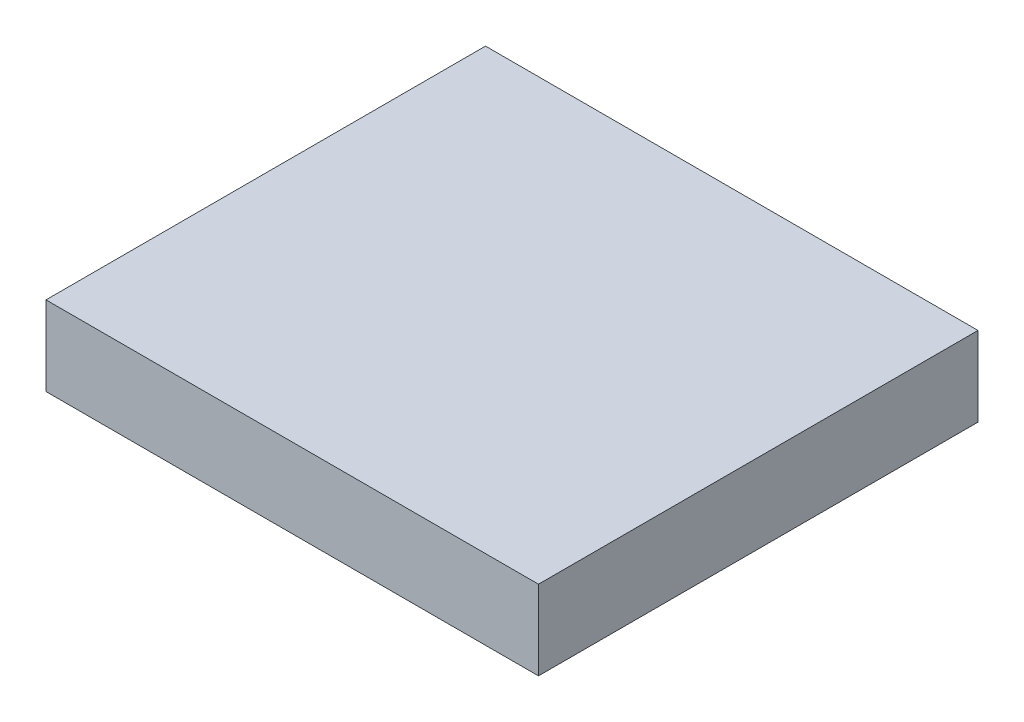
ISO-10303-21;
HEADER;
FILE_DESCRIPTION(('STEP AP214'),'2;1');
FILE_NAME('part.step','',(''),(''),'','','');
FILE_SCHEMA(('AUTOMOTIVE_DESIGN { 1 0 10303 214 1 1 1 1 }'));
ENDSEC;
DATA;
#1=APPLICATION_CONTEXT('core data for automotive mechanical design processes');
#2=APPLICATION_PROTOCOL_DEFINITION('international standard','automotive_design',2000,#1);
#3=PRODUCT_CONTEXT('',#1,'mechanical');
#4=PRODUCT('Part','Part','',(#3));
#5=PRODUCT_RELATED_PRODUCT_CATEGORY('part','',(#4));
#6=PRODUCT_DEFINITION_FORMATION('','',#4);
#7=PRODUCT_DEFINITION_CONTEXT('part definition',#1,'design');
#8=PRODUCT_DEFINITION('design','',#6,#7);
#9=PRODUCT_DEFINITION_SHAPE('','',#8);
#10=(LENGTH_UNIT() NAMED_UNIT(*) SI_UNIT(.MILLI.,.METRE.));
#11=(NAMED_UNIT(*) PLANE_ANGLE_UNIT() SI_UNIT($,.RADIAN.));
#12=(NAMED_UNIT(*) SI_UNIT($,.STERADIAN.) SOLID_ANGLE_UNIT());
#13=UNCERTAINTY_MEASURE_WITH_UNIT(LENGTH_MEASURE(1.E-05),#10,'distance_accuracy_value','');
#14=(GEOMETRIC_REPRESENTATION_CONTEXT(3) GLOBAL_UNCERTAINTY_ASSIGNED_CONTEXT((#13)) GLOBAL_UNIT_ASSIGNED_CONTEXT((#10,
#11,#12)) REPRESENTATION_CONTEXT('',''));
#15=CARTESIAN_POINT('',(0.,0.,0.));
#16=DIRECTION('',(0.,0.,1.));
#17=DIRECTION('',(1.,0.,0.));
#18=AXIS2_PLACEMENT_3D('',#15,#16,#17);
#19=CARTESIAN_POINT('',(46.5,15.,-41.5));
#20=DIRECTION('',(-1.,0.,0.));
#21=DIRECTION('',(0.,0.,1.));
#22=AXIS2_PLACEMENT_3D('',#19,#20,#21);
#23=PLANE('',#22);
#24=DIRECTION('',(0.,0.,-1.));
#25=VECTOR('',#24,1.);
#26=CARTESIAN_POINT('',(46.5,0.,-41.5));
#27=LINE('',#26,#25);
#28=CARTESIAN_POINT('',(46.5,0.,41.5));
#29=VERTEX_POINT('',#28);
#30=CARTESIAN_POINT('',(46.5,0.,-41.5));
#31=VERTEX_POINT('',#30);
#32=EDGE_CURVE('E95',#29,#31,#27,.T.);
#33=ORIENTED_EDGE('',*,*,#32,.T.);
#34=DIRECTION('',(0.,-1.,0.));
#35=VECTOR('',#34,1.);
#36=CARTESIAN_POINT('',(46.5,15.,-41.5));
#37=LINE('',#36,#35);
#38=CARTESIAN_POINT('',(46.5,15.,-41.5));
#39=VERTEX_POINT('',#38);
#40=EDGE_CURVE('E11',#39,#31,#37,.T.);
#41=ORIENTED_EDGE('',*,*,#40,.F.);
#42=DIRECTION('',(0.,0.,-1.));
#43=VECTOR('',#42,1.);
#44=CARTESIAN_POINT('',(46.5,15.,-41.5));
#45=LINE('',#44,#43);
#46=CARTESIAN_POINT('',(46.5,15.,41.5));
#47=VERTEX_POINT('',#46);
#48=EDGE_CURVE('E83',#47,#39,#45,.T.);
#49=ORIENTED_EDGE('',*,*,#48,.F.);
#50=DIRECTION('',(0.,-1.,0.));
#51=VECTOR('',#50,1.);
#52=CARTESIAN_POINT('',(46.5,15.,41.5));
#53=LINE('',#52,#51);
#54=EDGE_CURVE('E91',#47,#29,#53,.T.);
#55=ORIENTED_EDGE('',*,*,#54,.T.);
#56=EDGE_LOOP('',(#33,#41,#49,#55));
#57=FACE_BOUND('',#56,.T.);
#58=ADVANCED_FACE('F32',(#57),#23,.F.);
#59=CARTESIAN_POINT('',(-46.5,15.,-41.5));
#60=DIRECTION('',(0.,0.,1.));
#61=DIRECTION('',(1.,0.,0.));
#62=AXIS2_PLACEMENT_3D('',#59,#60,#61);
#63=PLANE('',#62);
#64=DIRECTION('',(-1.,0.,0.));
#65=VECTOR('',#64,1.);
#66=CARTESIAN_POINT('',(-46.5,0.,-41.5));
#67=LINE('',#66,#65);
#68=CARTESIAN_POINT('',(-46.5,0.,-41.5));
#69=VERTEX_POINT('',#68);
#70=EDGE_CURVE('E87',#31,#69,#67,.T.);
#71=ORIENTED_EDGE('',*,*,#70,.T.);
#72=DIRECTION('',(0.,-1.,0.));
#73=VECTOR('',#72,1.);
#74=CARTESIAN_POINT('',(-46.5,15.,-41.5));
#75=LINE('',#74,#73);
#76=CARTESIAN_POINT('',(-46.5,15.,-41.5));
#77=VERTEX_POINT('',#76);
#78=EDGE_CURVE('E40',#77,#69,#75,.T.);
#79=ORIENTED_EDGE('',*,*,#78,.F.);
#80=DIRECTION('',(-1.,0.,0.));
#81=VECTOR('',#80,1.);
#82=CARTESIAN_POINT('',(-46.5,15.,-41.5));
#83=LINE('',#82,#81);
#84=EDGE_CURVE('E78',#39,#77,#83,.T.);
#85=ORIENTED_EDGE('',*,*,#84,.F.);
#86=ORIENTED_EDGE('',*,*,#40,.T.);
#87=EDGE_LOOP('',(#71,#79,#85,#86));
#88=FACE_BOUND('',#87,.T.);
#89=ADVANCED_FACE('F86',(#88),#63,.F.);
#90=CARTESIAN_POINT('',(-46.5,15.,-41.5));
#91=DIRECTION('',(1.,0.,0.));
#92=DIRECTION('',(0.,0.,-1.));
#93=AXIS2_PLACEMENT_3D('',#90,#91,#92);
#94=PLANE('',#93);
#95=DIRECTION('',(0.,0.,1.));
#96=VECTOR('',#95,1.);
#97=CARTESIAN_POINT('',(-46.5,0.,-41.5));
#98=LINE('',#97,#96);
#99=CARTESIAN_POINT('',(-46.5,0.,41.5));
#100=VERTEX_POINT('',#99);
#101=EDGE_CURVE('E65',#69,#100,#98,.T.);
#102=ORIENTED_EDGE('',*,*,#101,.T.);
#103=DIRECTION('',(0.,-1.,0.));
#104=VECTOR('',#103,1.);
#105=CARTESIAN_POINT('',(-46.5,15.,41.5));
#106=LINE('',#105,#104);
#107=CARTESIAN_POINT('',(-46.5,15.,41.5));
#108=VERTEX_POINT('',#107);
#109=EDGE_CURVE('E88',#108,#100,#106,.T.);
#110=ORIENTED_EDGE('',*,*,#109,.F.);
#111=DIRECTION('',(0.,0.,1.));
#112=VECTOR('',#111,1.);
#113=CARTESIAN_POINT('',(-46.5,15.,-41.5));
#114=LINE('',#113,#112);
#115=EDGE_CURVE('E81',#77,#108,#114,.T.);
#116=ORIENTED_EDGE('',*,*,#115,.F.);
#117=ORIENTED_EDGE('',*,*,#78,.T.);
#118=EDGE_LOOP('',(#102,#110,#116,#117));
#119=FACE_BOUND('',#118,.T.);
#120=ADVANCED_FACE('F89',(#119),#94,.F.);
#121=CARTESIAN_POINT('',(-46.5,15.,41.5));
#122=DIRECTION('',(0.,0.,-1.));
#123=DIRECTION('',(-1.,0.,0.));
#124=AXIS2_PLACEMENT_3D('',#121,#122,#123);
#125=PLANE('',#124);
#126=DIRECTION('',(1.,0.,0.));
#127=VECTOR('',#126,1.);
#128=CARTESIAN_POINT('',(-46.5,0.,41.5));
#129=LINE('',#128,#127);
#130=EDGE_CURVE('E71',#100,#29,#129,.T.);
#131=ORIENTED_EDGE('',*,*,#130,.T.);
#132=ORIENTED_EDGE('',*,*,#54,.F.);
#133=DIRECTION('',(1.,0.,0.));
#134=VECTOR('',#133,1.);
#135=CARTESIAN_POINT('',(-46.5,15.,41.5));
#136=LINE('',#135,#134);
#137=EDGE_CURVE('E48',#108,#47,#136,.T.);
#138=ORIENTED_EDGE('',*,*,#137,.F.);
#139=ORIENTED_EDGE('',*,*,#109,.T.);
#140=EDGE_LOOP('',(#131,#132,#138,#139));
#141=FACE_BOUND('',#140,.T.);
#142=ADVANCED_FACE('F102',(#141),#125,.F.);
#143=CARTESIAN_POINT('',(0.,15.,0.));
#144=DIRECTION('',(0.,1.,0.));
#145=DIRECTION('',(0.,0.,1.));
#146=AXIS2_PLACEMENT_3D('',#143,#144,#145);
#147=PLANE('',#146);
#148=ORIENTED_EDGE('',*,*,#48,.T.);
#149=ORIENTED_EDGE('',*,*,#84,.T.);
#150=ORIENTED_EDGE('',*,*,#115,.T.);
#151=ORIENTED_EDGE('',*,*,#137,.T.);
#152=EDGE_LOOP('',(#148,#149,#150,#151));
#153=FACE_BOUND('',#152,.T.);
#154=ADVANCED_FACE('F79',(#153),#147,.T.);
#155=CARTESIAN_POINT('',(0.,0.,0.));
#156=DIRECTION('',(0.,1.,0.));
#157=DIRECTION('',(0.,0.,1.));
#158=AXIS2_PLACEMENT_3D('',#155,#156,#157);
#159=PLANE('',#158);
#160=ORIENTED_EDGE('',*,*,#32,.F.);
#161=ORIENTED_EDGE('',*,*,#130,.F.);
#162=ORIENTED_EDGE('',*,*,#101,.F.);
#163=ORIENTED_EDGE('',*,*,#70,.F.);
#164=EDGE_LOOP('',(#160,#161,#162,#163));
#165=FACE_BOUND('',#164,.T.);
#166=ADVANCED_FACE('F105',(#165),#159,.F.);
#167=CLOSED_SHELL('',(#58,#89,#120,#142,#154,#166));
#168=MANIFOLD_SOLID_BREP('B2',#167);
#169=ADVANCED_BREP_SHAPE_REPRESENTATION('',(#18,#168),#14);
#170=SHAPE_DEFINITION_REPRESENTATION(#9,#169);
ENDSEC;
END-ISO-10303-21;
